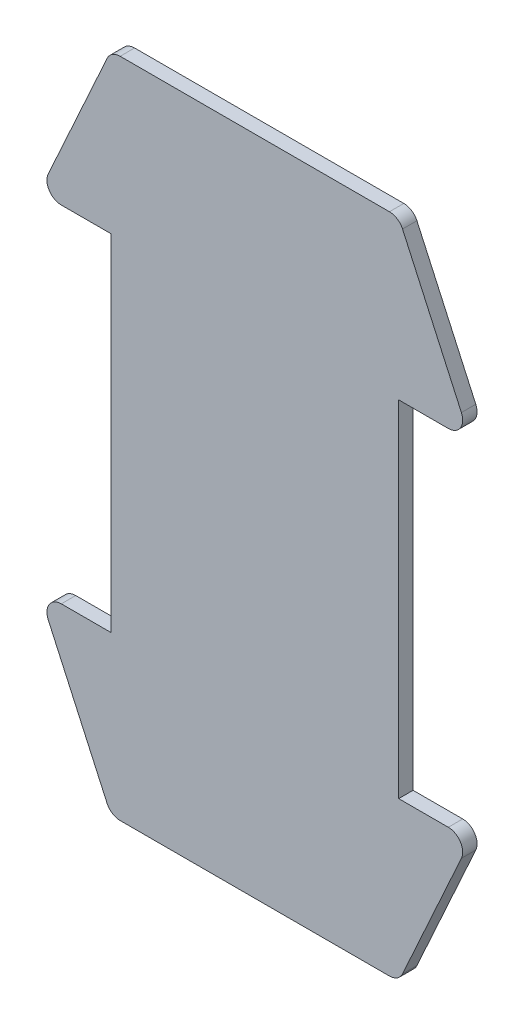
ISO-10303-21;
HEADER;
FILE_DESCRIPTION(('STEP AP214'),'2;1');
FILE_NAME('part.step','',(''),(''),'','','');
FILE_SCHEMA(('AUTOMOTIVE_DESIGN { 1 0 10303 214 1 1 1 1 }'));
ENDSEC;
DATA;
#1=APPLICATION_CONTEXT('core data for automotive mechanical design processes');
#2=APPLICATION_PROTOCOL_DEFINITION('international standard','automotive_design',2000,#1);
#3=PRODUCT_CONTEXT('',#1,'mechanical');
#4=PRODUCT('Part','Part','',(#3));
#5=PRODUCT_RELATED_PRODUCT_CATEGORY('part','',(#4));
#6=PRODUCT_DEFINITION_FORMATION('','',#4);
#7=PRODUCT_DEFINITION_CONTEXT('part definition',#1,'design');
#8=PRODUCT_DEFINITION('design','',#6,#7);
#9=PRODUCT_DEFINITION_SHAPE('','',#8);
#10=(LENGTH_UNIT() NAMED_UNIT(*) SI_UNIT(.MILLI.,.METRE.));
#11=(NAMED_UNIT(*) PLANE_ANGLE_UNIT() SI_UNIT($,.RADIAN.));
#12=(NAMED_UNIT(*) SI_UNIT($,.STERADIAN.) SOLID_ANGLE_UNIT());
#13=UNCERTAINTY_MEASURE_WITH_UNIT(LENGTH_MEASURE(1.E-05),#10,'distance_accuracy_value','');
#14=(GEOMETRIC_REPRESENTATION_CONTEXT(3) GLOBAL_UNCERTAINTY_ASSIGNED_CONTEXT((#13)) GLOBAL_UNIT_ASSIGNED_CONTEXT((#10,
#11,#12)) REPRESENTATION_CONTEXT('',''));
#15=CARTESIAN_POINT('',(0.,0.,0.));
#16=DIRECTION('',(0.,0.,1.));
#17=DIRECTION('',(1.,0.,0.));
#18=AXIS2_PLACEMENT_3D('',#15,#16,#17);
#19=CARTESIAN_POINT('',(-50.,115.,-5.));
#20=DIRECTION('',(-0.910366477462605,0.413802944301184,0.));
#21=DIRECTION('',(-0.413802944301184,-0.910366477462605,0.));
#22=AXIS2_PLACEMENT_3D('',#19,#20,#21);
#23=PLANE('',#22);
#24=DIRECTION('',(-0.413802944301183,-0.910366477462605,0.));
#25=VECTOR('',#24,1.);
#26=CARTESIAN_POINT('',(-50.,115.,-5.));
#27=LINE('',#26,#25);
#28=CARTESIAN_POINT('',(-51.3322660356791,112.069014721506,-5.));
#29=VERTEX_POINT('',#28);
#30=CARTESIAN_POINT('',(-71.7868114902246,67.0690147215059,-5.));
#31=VERTEX_POINT('',#30);
#32=EDGE_CURVE('E186',#29,#31,#27,.T.);
#33=ORIENTED_EDGE('',*,*,#32,.T.);
#34=DIRECTION('',(0.,0.,1.));
#35=VECTOR('',#34,1.);
#36=CARTESIAN_POINT('',(-71.7868114902246,67.0690147215059,-5.));
#37=LINE('',#36,#35);
#38=CARTESIAN_POINT('',(-71.7868114902246,67.0690147215059,0.));
#39=VERTEX_POINT('',#38);
#40=EDGE_CURVE('E378',#31,#39,#37,.T.);
#41=ORIENTED_EDGE('',*,*,#40,.T.);
#42=DIRECTION('',(-0.413802944301183,-0.910366477462605,0.));
#43=VECTOR('',#42,1.);
#44=CARTESIAN_POINT('',(-50.,115.,0.));
#45=LINE('',#44,#43);
#46=CARTESIAN_POINT('',(-51.3322660356791,112.069014721506,0.));
#47=VERTEX_POINT('',#46);
#48=EDGE_CURVE('E236',#47,#39,#45,.T.);
#49=ORIENTED_EDGE('',*,*,#48,.F.);
#50=DIRECTION('',(0.,0.,1.));
#51=VECTOR('',#50,1.);
#52=CARTESIAN_POINT('',(-51.3322660356791,112.069014721506,-5.));
#53=LINE('',#52,#51);
#54=EDGE_CURVE('E375',#47,#29,#53,.F.);
#55=ORIENTED_EDGE('',*,*,#54,.T.);
#56=EDGE_LOOP('',(#33,#41,#49,#55));
#57=FACE_BOUND('',#56,.T.);
#58=ADVANCED_FACE('F39',(#57),#23,.T.);
#59=CARTESIAN_POINT('',(50.,115.,-5.));
#60=DIRECTION('',(0.,1.,0.));
#61=DIRECTION('',(0.,0.,1.));
#62=AXIS2_PLACEMENT_3D('',#59,#60,#61);
#63=PLANE('',#62);
#64=DIRECTION('',(-1.,0.,0.));
#65=VECTOR('',#64,1.);
#66=CARTESIAN_POINT('',(50.,115.,0.));
#67=LINE('',#66,#65);
#68=CARTESIAN_POINT('',(46.7804336483661,115.,0.));
#69=VERTEX_POINT('',#68);
#70=CARTESIAN_POINT('',(-46.7804336483661,115.,0.));
#71=VERTEX_POINT('',#70);
#72=EDGE_CURVE('E276',#69,#71,#67,.T.);
#73=ORIENTED_EDGE('',*,*,#72,.F.);
#74=DIRECTION('',(0.,0.,1.));
#75=VECTOR('',#74,1.);
#76=CARTESIAN_POINT('',(46.7804336483661,115.,-5.));
#77=LINE('',#76,#75);
#78=CARTESIAN_POINT('',(46.7804336483661,115.,-5.));
#79=VERTEX_POINT('',#78);
#80=EDGE_CURVE('E11',#69,#79,#77,.F.);
#81=ORIENTED_EDGE('',*,*,#80,.T.);
#82=DIRECTION('',(-1.,0.,0.));
#83=VECTOR('',#82,1.);
#84=CARTESIAN_POINT('',(50.,115.,-5.));
#85=LINE('',#84,#83);
#86=CARTESIAN_POINT('',(-46.7804336483661,115.,-5.));
#87=VERTEX_POINT('',#86);
#88=EDGE_CURVE('E195',#79,#87,#85,.T.);
#89=ORIENTED_EDGE('',*,*,#88,.T.);
#90=DIRECTION('',(0.,0.,1.));
#91=VECTOR('',#90,1.);
#92=CARTESIAN_POINT('',(-46.7804336483661,115.,-5.));
#93=LINE('',#92,#91);
#94=EDGE_CURVE('E48',#87,#71,#93,.T.);
#95=ORIENTED_EDGE('',*,*,#94,.T.);
#96=EDGE_LOOP('',(#73,#81,#89,#95));
#97=FACE_BOUND('',#96,.T.);
#98=ADVANCED_FACE('F388',(#97),#63,.T.);
#99=CARTESIAN_POINT('',(50.,115.,-5.));
#100=DIRECTION('',(0.910366477462605,0.413802944301184,0.));
#101=DIRECTION('',(-0.413802944301184,0.910366477462605,0.));
#102=AXIS2_PLACEMENT_3D('',#99,#100,#101);
#103=PLANE('',#102);
#104=DIRECTION('',(-0.413802944301183,0.910366477462605,0.));
#105=VECTOR('',#104,1.);
#106=CARTESIAN_POINT('',(50.,115.,0.));
#107=LINE('',#106,#105);
#108=CARTESIAN_POINT('',(71.7868114902246,67.0690147215059,0.));
#109=VERTEX_POINT('',#108);
#110=CARTESIAN_POINT('',(51.3322660356791,112.069014721506,0.));
#111=VERTEX_POINT('',#110);
#112=EDGE_CURVE('E272',#109,#111,#107,.T.);
#113=ORIENTED_EDGE('',*,*,#112,.F.);
#114=DIRECTION('',(0.,0.,1.));
#115=VECTOR('',#114,1.);
#116=CARTESIAN_POINT('',(71.7868114902246,67.0690147215059,-5.));
#117=LINE('',#116,#115);
#118=CARTESIAN_POINT('',(71.7868114902246,67.0690147215059,-5.));
#119=VERTEX_POINT('',#118);
#120=EDGE_CURVE('E372',#109,#119,#117,.F.);
#121=ORIENTED_EDGE('',*,*,#120,.T.);
#122=DIRECTION('',(-0.413802944301183,0.910366477462605,0.));
#123=VECTOR('',#122,1.);
#124=CARTESIAN_POINT('',(50.,115.,-5.));
#125=LINE('',#124,#123);
#126=CARTESIAN_POINT('',(51.3322660356791,112.069014721506,-5.));
#127=VERTEX_POINT('',#126);
#128=EDGE_CURVE('E229',#119,#127,#125,.T.);
#129=ORIENTED_EDGE('',*,*,#128,.T.);
#130=DIRECTION('',(0.,0.,1.));
#131=VECTOR('',#130,1.);
#132=CARTESIAN_POINT('',(51.3322660356791,112.069014721506,-5.));
#133=LINE('',#132,#131);
#134=EDGE_CURVE('E368',#127,#111,#133,.T.);
#135=ORIENTED_EDGE('',*,*,#134,.T.);
#136=EDGE_LOOP('',(#113,#121,#129,#135));
#137=FACE_BOUND('',#136,.T.);
#138=ADVANCED_FACE('F402',(#137),#103,.T.);
#139=CARTESIAN_POINT('',(75.,60.,-5.));
#140=DIRECTION('',(0.,-1.,0.));
#141=DIRECTION('',(0.,0.,-1.));
#142=AXIS2_PLACEMENT_3D('',#139,#140,#141);
#143=PLANE('',#142);
#144=DIRECTION('',(1.,0.,0.));
#145=VECTOR('',#144,1.);
#146=CARTESIAN_POINT('',(75.,60.,-5.));
#147=LINE('',#146,#145);
#148=CARTESIAN_POINT('',(50.,60.,-5.));
#149=VERTEX_POINT('',#148);
#150=CARTESIAN_POINT('',(67.2349791029115,60.,-5.));
#151=VERTEX_POINT('',#150);
#152=EDGE_CURVE('E225',#149,#151,#147,.T.);
#153=ORIENTED_EDGE('',*,*,#152,.T.);
#154=DIRECTION('',(0.,0.,1.));
#155=VECTOR('',#154,1.);
#156=CARTESIAN_POINT('',(67.2349791029115,60.,-5.));
#157=LINE('',#156,#155);
#158=CARTESIAN_POINT('',(67.2349791029115,60.,0.));
#159=VERTEX_POINT('',#158);
#160=EDGE_CURVE('E364',#151,#159,#157,.T.);
#161=ORIENTED_EDGE('',*,*,#160,.T.);
#162=DIRECTION('',(1.,0.,0.));
#163=VECTOR('',#162,1.);
#164=CARTESIAN_POINT('',(75.,60.,0.));
#165=LINE('',#164,#163);
#166=CARTESIAN_POINT('',(50.,60.,0.));
#167=VERTEX_POINT('',#166);
#168=EDGE_CURVE('E268',#167,#159,#165,.T.);
#169=ORIENTED_EDGE('',*,*,#168,.F.);
#170=DIRECTION('',(0.,0.,1.));
#171=VECTOR('',#170,1.);
#172=CARTESIAN_POINT('',(50.,60.,-5.));
#173=LINE('',#172,#171);
#174=EDGE_CURVE('E280',#149,#167,#173,.T.);
#175=ORIENTED_EDGE('',*,*,#174,.F.);
#176=EDGE_LOOP('',(#153,#161,#169,#175));
#177=FACE_BOUND('',#176,.T.);
#178=ADVANCED_FACE('F412',(#177),#143,.T.);
#179=CARTESIAN_POINT('',(50.,60.,-5.));
#180=DIRECTION('',(1.,0.,0.));
#181=DIRECTION('',(0.,1.,0.));
#182=AXIS2_PLACEMENT_3D('',#179,#180,#181);
#183=PLANE('',#182);
#184=DIRECTION('',(0.,1.,0.));
#185=VECTOR('',#184,1.);
#186=CARTESIAN_POINT('',(50.,60.,0.));
#187=LINE('',#186,#185);
#188=CARTESIAN_POINT('',(50.,-59.9999999999999,0.));
#189=VERTEX_POINT('',#188);
#190=EDGE_CURVE('E264',#189,#167,#187,.T.);
#191=ORIENTED_EDGE('',*,*,#190,.F.);
#192=DIRECTION('',(0.,0.,1.));
#193=VECTOR('',#192,1.);
#194=CARTESIAN_POINT('',(50.,-59.9999999999999,-5.));
#195=LINE('',#194,#193);
#196=CARTESIAN_POINT('',(50.,-59.9999999999999,-5.));
#197=VERTEX_POINT('',#196);
#198=EDGE_CURVE('E284',#197,#189,#195,.T.);
#199=ORIENTED_EDGE('',*,*,#198,.F.);
#200=DIRECTION('',(0.,1.,0.));
#201=VECTOR('',#200,1.);
#202=CARTESIAN_POINT('',(50.,60.,-5.));
#203=LINE('',#202,#201);
#204=EDGE_CURVE('E221',#197,#149,#203,.T.);
#205=ORIENTED_EDGE('',*,*,#204,.T.);
#206=ORIENTED_EDGE('',*,*,#174,.T.);
#207=EDGE_LOOP('',(#191,#199,#205,#206));
#208=FACE_BOUND('',#207,.T.);
#209=ADVANCED_FACE('F417',(#208),#183,.T.);
#210=CARTESIAN_POINT('',(75.,-59.9999999999999,-5.));
#211=DIRECTION('',(0.,1.,0.));
#212=DIRECTION('',(-1.,0.,0.));
#213=AXIS2_PLACEMENT_3D('',#210,#211,#212);
#214=PLANE('',#213);
#215=DIRECTION('',(-1.,0.,0.));
#216=VECTOR('',#215,1.);
#217=CARTESIAN_POINT('',(75.,-59.9999999999999,0.));
#218=LINE('',#217,#216);
#219=CARTESIAN_POINT('',(67.2349791029116,-59.9999999999999,0.));
#220=VERTEX_POINT('',#219);
#221=EDGE_CURVE('E261',#220,#189,#218,.T.);
#222=ORIENTED_EDGE('',*,*,#221,.F.);
#223=DIRECTION('',(0.,0.,1.));
#224=VECTOR('',#223,1.);
#225=CARTESIAN_POINT('',(67.2349791029116,-59.9999999999999,-5.));
#226=LINE('',#225,#224);
#227=CARTESIAN_POINT('',(67.2349791029116,-59.9999999999999,-5.));
#228=VERTEX_POINT('',#227);
#229=EDGE_CURVE('E361',#220,#228,#226,.F.);
#230=ORIENTED_EDGE('',*,*,#229,.T.);
#231=DIRECTION('',(-1.,0.,0.));
#232=VECTOR('',#231,1.);
#233=CARTESIAN_POINT('',(75.,-59.9999999999999,-5.));
#234=LINE('',#233,#232);
#235=EDGE_CURVE('E218',#228,#197,#234,.T.);
#236=ORIENTED_EDGE('',*,*,#235,.T.);
#237=ORIENTED_EDGE('',*,*,#198,.T.);
#238=EDGE_LOOP('',(#222,#230,#236,#237));
#239=FACE_BOUND('',#238,.T.);
#240=ADVANCED_FACE('F581',(#239),#214,.T.);
#241=CARTESIAN_POINT('',(50.0000000000001,-115.,-5.));
#242=DIRECTION('',(0.910366477462605,-0.413802944301183,0.));
#243=DIRECTION('',(0.413802944301183,0.910366477462605,0.));
#244=AXIS2_PLACEMENT_3D('',#241,#242,#243);
#245=PLANE('',#244);
#246=DIRECTION('',(0.413802944301183,0.910366477462605,0.));
#247=VECTOR('',#246,1.);
#248=CARTESIAN_POINT('',(50.0000000000001,-115.,0.));
#249=LINE('',#248,#247);
#250=CARTESIAN_POINT('',(51.3322660356792,-112.069014721506,0.));
#251=VERTEX_POINT('',#250);
#252=CARTESIAN_POINT('',(71.7868114902246,-67.0690147215059,0.));
#253=VERTEX_POINT('',#252);
#254=EDGE_CURVE('E257',#251,#253,#249,.T.);
#255=ORIENTED_EDGE('',*,*,#254,.F.);
#256=DIRECTION('',(0.,0.,1.));
#257=VECTOR('',#256,1.);
#258=CARTESIAN_POINT('',(51.3322660356792,-112.069014721506,-5.));
#259=LINE('',#258,#257);
#260=CARTESIAN_POINT('',(51.3322660356792,-112.069014721506,-5.));
#261=VERTEX_POINT('',#260);
#262=EDGE_CURVE('E358',#251,#261,#259,.F.);
#263=ORIENTED_EDGE('',*,*,#262,.T.);
#264=DIRECTION('',(0.413802944301183,0.910366477462605,0.));
#265=VECTOR('',#264,1.);
#266=CARTESIAN_POINT('',(50.0000000000001,-115.,-5.));
#267=LINE('',#266,#265);
#268=CARTESIAN_POINT('',(71.7868114902246,-67.0690147215059,-5.));
#269=VERTEX_POINT('',#268);
#270=EDGE_CURVE('E214',#261,#269,#267,.T.);
#271=ORIENTED_EDGE('',*,*,#270,.T.);
#272=DIRECTION('',(0.,0.,1.));
#273=VECTOR('',#272,1.);
#274=CARTESIAN_POINT('',(71.7868114902246,-67.0690147215058,-5.));
#275=LINE('',#274,#273);
#276=EDGE_CURVE('E354',#269,#253,#275,.T.);
#277=ORIENTED_EDGE('',*,*,#276,.T.);
#278=EDGE_LOOP('',(#255,#263,#271,#277));
#279=FACE_BOUND('',#278,.T.);
#280=ADVANCED_FACE('F429',(#279),#245,.T.);
#281=CARTESIAN_POINT('',(50.0000000000001,-115.,-5.));
#282=DIRECTION('',(0.,-1.,0.));
#283=DIRECTION('',(0.,0.,-1.));
#284=AXIS2_PLACEMENT_3D('',#281,#282,#283);
#285=PLANE('',#284);
#286=DIRECTION('',(1.,0.,0.));
#287=VECTOR('',#286,1.);
#288=CARTESIAN_POINT('',(50.0000000000001,-115.,0.));
#289=LINE('',#288,#287);
#290=CARTESIAN_POINT('',(-46.7804336483662,-115.,0.));
#291=VERTEX_POINT('',#290);
#292=CARTESIAN_POINT('',(46.7804336483662,-115.,0.));
#293=VERTEX_POINT('',#292);
#294=EDGE_CURVE('E253',#291,#293,#289,.T.);
#295=ORIENTED_EDGE('',*,*,#294,.F.);
#296=DIRECTION('',(0.,0.,1.));
#297=VECTOR('',#296,1.);
#298=CARTESIAN_POINT('',(-46.7804336483662,-115.,-5.));
#299=LINE('',#298,#297);
#300=CARTESIAN_POINT('',(-46.7804336483662,-115.,-5.));
#301=VERTEX_POINT('',#300);
#302=EDGE_CURVE('E324',#291,#301,#299,.F.);
#303=ORIENTED_EDGE('',*,*,#302,.T.);
#304=DIRECTION('',(1.,0.,0.));
#305=VECTOR('',#304,1.);
#306=CARTESIAN_POINT('',(50.0000000000001,-115.,-5.));
#307=LINE('',#306,#305);
#308=CARTESIAN_POINT('',(46.7804336483662,-115.,-5.));
#309=VERTEX_POINT('',#308);
#310=EDGE_CURVE('E210',#301,#309,#307,.T.);
#311=ORIENTED_EDGE('',*,*,#310,.T.);
#312=DIRECTION('',(0.,0.,1.));
#313=VECTOR('',#312,1.);
#314=CARTESIAN_POINT('',(46.7804336483662,-115.,-5.));
#315=LINE('',#314,#313);
#316=EDGE_CURVE('E320',#309,#293,#315,.T.);
#317=ORIENTED_EDGE('',*,*,#316,.T.);
#318=EDGE_LOOP('',(#295,#303,#311,#317));
#319=FACE_BOUND('',#318,.T.);
#320=ADVANCED_FACE('F437',(#319),#285,.T.);
#321=CARTESIAN_POINT('',(-50.0000000000001,-115.,-5.));
#322=DIRECTION('',(-0.910366477462605,-0.413802944301183,0.));
#323=DIRECTION('',(0.413802944301183,-0.910366477462605,0.));
#324=AXIS2_PLACEMENT_3D('',#321,#322,#323);
#325=PLANE('',#324);
#326=DIRECTION('',(0.413802944301183,-0.910366477462605,0.));
#327=VECTOR('',#326,1.);
#328=CARTESIAN_POINT('',(-50.0000000000001,-115.,-5.));
#329=LINE('',#328,#327);
#330=CARTESIAN_POINT('',(-71.7868114902246,-67.0690147215059,-5.));
#331=VERTEX_POINT('',#330);
#332=CARTESIAN_POINT('',(-51.3322660356792,-112.069014721506,-5.));
#333=VERTEX_POINT('',#332);
#334=EDGE_CURVE('E203',#331,#333,#329,.T.);
#335=ORIENTED_EDGE('',*,*,#334,.T.);
#336=DIRECTION('',(0.,0.,1.));
#337=VECTOR('',#336,1.);
#338=CARTESIAN_POINT('',(-51.3322660356792,-112.069014721506,-5.));
#339=LINE('',#338,#337);
#340=CARTESIAN_POINT('',(-51.3322660356792,-112.069014721506,0.));
#341=VERTEX_POINT('',#340);
#342=EDGE_CURVE('E292',#333,#341,#339,.T.);
#343=ORIENTED_EDGE('',*,*,#342,.T.);
#344=DIRECTION('',(0.413802944301183,-0.910366477462605,0.));
#345=VECTOR('',#344,1.);
#346=CARTESIAN_POINT('',(-50.0000000000001,-115.,0.));
#347=LINE('',#346,#345);
#348=CARTESIAN_POINT('',(-71.7868114902246,-67.0690147215059,0.));
#349=VERTEX_POINT('',#348);
#350=EDGE_CURVE('E249',#349,#341,#347,.T.);
#351=ORIENTED_EDGE('',*,*,#350,.F.);
#352=DIRECTION('',(0.,0.,1.));
#353=VECTOR('',#352,1.);
#354=CARTESIAN_POINT('',(-71.7868114902246,-67.0690147215058,-5.));
#355=LINE('',#354,#353);
#356=EDGE_CURVE('E283',#349,#331,#355,.F.);
#357=ORIENTED_EDGE('',*,*,#356,.T.);
#358=EDGE_LOOP('',(#335,#343,#351,#357));
#359=FACE_BOUND('',#358,.T.);
#360=ADVANCED_FACE('F445',(#359),#325,.T.);
#361=CARTESIAN_POINT('',(-75.,-59.9999999999999,-5.));
#362=DIRECTION('',(0.,1.,0.));
#363=DIRECTION('',(-1.,0.,0.));
#364=AXIS2_PLACEMENT_3D('',#361,#362,#363);
#365=PLANE('',#364);
#366=DIRECTION('',(-1.,0.,0.));
#367=VECTOR('',#366,1.);
#368=CARTESIAN_POINT('',(-75.,-59.9999999999999,-5.));
#369=LINE('',#368,#367);
#370=CARTESIAN_POINT('',(-50.,-59.9999999999999,-5.));
#371=VERTEX_POINT('',#370);
#372=CARTESIAN_POINT('',(-67.2349791029116,-59.9999999999999,-5.));
#373=VERTEX_POINT('',#372);
#374=EDGE_CURVE('E199',#371,#373,#369,.T.);
#375=ORIENTED_EDGE('',*,*,#374,.T.);
#376=DIRECTION('',(0.,0.,1.));
#377=VECTOR('',#376,1.);
#378=CARTESIAN_POINT('',(-67.2349791029116,-59.9999999999999,-5.));
#379=LINE('',#378,#377);
#380=CARTESIAN_POINT('',(-67.2349791029116,-59.9999999999999,0.));
#381=VERTEX_POINT('',#380);
#382=EDGE_CURVE('E350',#373,#381,#379,.T.);
#383=ORIENTED_EDGE('',*,*,#382,.T.);
#384=DIRECTION('',(-1.,0.,0.));
#385=VECTOR('',#384,1.);
#386=CARTESIAN_POINT('',(-75.,-59.9999999999999,0.));
#387=LINE('',#386,#385);
#388=CARTESIAN_POINT('',(-50.,-59.9999999999999,0.));
#389=VERTEX_POINT('',#388);
#390=EDGE_CURVE('E245',#389,#381,#387,.T.);
#391=ORIENTED_EDGE('',*,*,#390,.F.);
#392=DIRECTION('',(0.,0.,1.));
#393=VECTOR('',#392,1.);
#394=CARTESIAN_POINT('',(-50.,-59.9999999999999,-5.));
#395=LINE('',#394,#393);
#396=EDGE_CURVE('E194',#371,#389,#395,.T.);
#397=ORIENTED_EDGE('',*,*,#396,.F.);
#398=EDGE_LOOP('',(#375,#383,#391,#397));
#399=FACE_BOUND('',#398,.T.);
#400=ADVANCED_FACE('F452',(#399),#365,.T.);
#401=CARTESIAN_POINT('',(-50.,60.,-5.));
#402=DIRECTION('',(-1.,0.,0.));
#403=DIRECTION('',(0.,-1.,0.));
#404=AXIS2_PLACEMENT_3D('',#401,#402,#403);
#405=PLANE('',#404);
#406=DIRECTION('',(0.,-1.,0.));
#407=VECTOR('',#406,1.);
#408=CARTESIAN_POINT('',(-50.,60.,0.));
#409=LINE('',#408,#407);
#410=CARTESIAN_POINT('',(-50.,60.,0.));
#411=VERTEX_POINT('',#410);
#412=EDGE_CURVE('E192',#411,#389,#409,.T.);
#413=ORIENTED_EDGE('',*,*,#412,.F.);
#414=DIRECTION('',(0.,0.,1.));
#415=VECTOR('',#414,1.);
#416=CARTESIAN_POINT('',(-50.,60.,-5.));
#417=LINE('',#416,#415);
#418=CARTESIAN_POINT('',(-50.,60.,-5.));
#419=VERTEX_POINT('',#418);
#420=EDGE_CURVE('E180',#419,#411,#417,.T.);
#421=ORIENTED_EDGE('',*,*,#420,.F.);
#422=DIRECTION('',(0.,-1.,0.));
#423=VECTOR('',#422,1.);
#424=CARTESIAN_POINT('',(-50.,60.,-5.));
#425=LINE('',#424,#423);
#426=EDGE_CURVE('E185',#419,#371,#425,.T.);
#427=ORIENTED_EDGE('',*,*,#426,.T.);
#428=ORIENTED_EDGE('',*,*,#396,.T.);
#429=EDGE_LOOP('',(#413,#421,#427,#428));
#430=FACE_BOUND('',#429,.T.);
#431=ADVANCED_FACE('F190',(#430),#405,.T.);
#432=CARTESIAN_POINT('',(-75.,60.,-5.));
#433=DIRECTION('',(0.,-1.,0.));
#434=DIRECTION('',(0.,0.,-1.));
#435=AXIS2_PLACEMENT_3D('',#432,#433,#434);
#436=PLANE('',#435);
#437=DIRECTION('',(1.,0.,0.));
#438=VECTOR('',#437,1.);
#439=CARTESIAN_POINT('',(-75.,60.,0.));
#440=LINE('',#439,#438);
#441=CARTESIAN_POINT('',(-67.2349791029115,60.,0.));
#442=VERTEX_POINT('',#441);
#443=EDGE_CURVE('E240',#442,#411,#440,.T.);
#444=ORIENTED_EDGE('',*,*,#443,.F.);
#445=DIRECTION('',(0.,0.,1.));
#446=VECTOR('',#445,1.);
#447=CARTESIAN_POINT('',(-67.2349791029115,60.,-5.));
#448=LINE('',#447,#446);
#449=CARTESIAN_POINT('',(-67.2349791029115,60.,-5.));
#450=VERTEX_POINT('',#449);
#451=EDGE_CURVE('E55',#442,#450,#448,.F.);
#452=ORIENTED_EDGE('',*,*,#451,.T.);
#453=DIRECTION('',(1.,0.,0.));
#454=VECTOR('',#453,1.);
#455=CARTESIAN_POINT('',(-75.,60.,-5.));
#456=LINE('',#455,#454);
#457=EDGE_CURVE('E177',#450,#419,#456,.T.);
#458=ORIENTED_EDGE('',*,*,#457,.T.);
#459=ORIENTED_EDGE('',*,*,#420,.T.);
#460=EDGE_LOOP('',(#444,#452,#458,#459));
#461=FACE_BOUND('',#460,.T.);
#462=ADVANCED_FACE('F179',(#461),#436,.T.);
#463=CARTESIAN_POINT('',(0.,0.,-5.));
#464=DIRECTION('',(0.,0.,1.));
#465=DIRECTION('',(1.,0.,0.));
#466=AXIS2_PLACEMENT_3D('',#463,#464,#465);
#467=PLANE('',#466);
#468=ORIENTED_EDGE('',*,*,#310,.F.);
#469=CARTESIAN_POINT('',(-46.7804336483662,-110.,-5.));
#470=DIRECTION('',(0.,0.,1.));
#471=DIRECTION('',(1.,0.,0.));
#472=AXIS2_PLACEMENT_3D('',#469,#470,#471);
#473=CIRCLE('',#472,5.);
#474=EDGE_CURVE('E347',#301,#333,#473,.F.);
#475=ORIENTED_EDGE('',*,*,#474,.T.);
#476=ORIENTED_EDGE('',*,*,#334,.F.);
#477=CARTESIAN_POINT('',(-67.2349791029116,-64.9999999999999,-5.));
#478=DIRECTION('',(0.,0.,1.));
#479=DIRECTION('',(1.,0.,0.));
#480=AXIS2_PLACEMENT_3D('',#477,#478,#479);
#481=CIRCLE('',#480,5.);
#482=EDGE_CURVE('E63',#331,#373,#481,.F.);
#483=ORIENTED_EDGE('',*,*,#482,.T.);
#484=ORIENTED_EDGE('',*,*,#374,.F.);
#485=ORIENTED_EDGE('',*,*,#426,.F.);
#486=ORIENTED_EDGE('',*,*,#457,.F.);
#487=CARTESIAN_POINT('',(-67.2349791029115,65.,-5.));
#488=DIRECTION('',(0.,0.,1.));
#489=DIRECTION('',(1.,0.,0.));
#490=AXIS2_PLACEMENT_3D('',#487,#488,#489);
#491=CIRCLE('',#490,5.);
#492=EDGE_CURVE('E333',#450,#31,#491,.F.);
#493=ORIENTED_EDGE('',*,*,#492,.T.);
#494=ORIENTED_EDGE('',*,*,#32,.F.);
#495=CARTESIAN_POINT('',(-46.7804336483661,110.,-5.));
#496=DIRECTION('',(0.,0.,1.));
#497=DIRECTION('',(1.,0.,0.));
#498=AXIS2_PLACEMENT_3D('',#495,#496,#497);
#499=CIRCLE('',#498,5.);
#500=EDGE_CURVE('E327',#29,#87,#499,.F.);
#501=ORIENTED_EDGE('',*,*,#500,.T.);
#502=ORIENTED_EDGE('',*,*,#88,.F.);
#503=CARTESIAN_POINT('',(46.7804336483661,110.,-5.));
#504=DIRECTION('',(0.,0.,1.));
#505=DIRECTION('',(1.,0.,0.));
#506=AXIS2_PLACEMENT_3D('',#503,#504,#505);
#507=CIRCLE('',#506,5.);
#508=EDGE_CURVE('E330',#79,#127,#507,.F.);
#509=ORIENTED_EDGE('',*,*,#508,.T.);
#510=ORIENTED_EDGE('',*,*,#128,.F.);
#511=CARTESIAN_POINT('',(67.2349791029115,65.,-5.));
#512=DIRECTION('',(0.,0.,1.));
#513=DIRECTION('',(1.,0.,0.));
#514=AXIS2_PLACEMENT_3D('',#511,#512,#513);
#515=CIRCLE('',#514,5.);
#516=EDGE_CURVE('E336',#119,#151,#515,.F.);
#517=ORIENTED_EDGE('',*,*,#516,.T.);
#518=ORIENTED_EDGE('',*,*,#152,.F.);
#519=ORIENTED_EDGE('',*,*,#204,.F.);
#520=ORIENTED_EDGE('',*,*,#235,.F.);
#521=CARTESIAN_POINT('',(67.2349791029116,-64.9999999999999,-5.));
#522=DIRECTION('',(0.,0.,1.));
#523=DIRECTION('',(1.,0.,0.));
#524=AXIS2_PLACEMENT_3D('',#521,#522,#523);
#525=CIRCLE('',#524,5.);
#526=EDGE_CURVE('E339',#228,#269,#525,.F.);
#527=ORIENTED_EDGE('',*,*,#526,.T.);
#528=ORIENTED_EDGE('',*,*,#270,.F.);
#529=CARTESIAN_POINT('',(46.7804336483662,-110.,-5.));
#530=DIRECTION('',(0.,0.,1.));
#531=DIRECTION('',(1.,0.,0.));
#532=AXIS2_PLACEMENT_3D('',#529,#530,#531);
#533=CIRCLE('',#532,5.);
#534=EDGE_CURVE('E342',#261,#309,#533,.F.);
#535=ORIENTED_EDGE('',*,*,#534,.T.);
#536=EDGE_LOOP('',(#468,#475,#476,#483,#484,#485,#486,#493,#494,#501,#502,#509,#510,#517,#518,
#519,#520,#527,#528,#535));
#537=FACE_BOUND('',#536,.T.);
#538=ADVANCED_FACE('F198',(#537),#467,.F.);
#539=CARTESIAN_POINT('',(0.,0.,0.));
#540=DIRECTION('',(0.,0.,1.));
#541=DIRECTION('',(1.,0.,0.));
#542=AXIS2_PLACEMENT_3D('',#539,#540,#541);
#543=PLANE('',#542);
#544=ORIENTED_EDGE('',*,*,#350,.T.);
#545=CARTESIAN_POINT('',(-46.7804336483662,-110.,0.));
#546=DIRECTION('',(0.,0.,1.));
#547=DIRECTION('',(1.,0.,0.));
#548=AXIS2_PLACEMENT_3D('',#545,#546,#547);
#549=CIRCLE('',#548,5.);
#550=EDGE_CURVE('E317',#341,#291,#549,.T.);
#551=ORIENTED_EDGE('',*,*,#550,.T.);
#552=ORIENTED_EDGE('',*,*,#294,.T.);
#553=CARTESIAN_POINT('',(46.7804336483662,-110.,0.));
#554=DIRECTION('',(0.,0.,1.));
#555=DIRECTION('',(1.,0.,0.));
#556=AXIS2_PLACEMENT_3D('',#553,#554,#555);
#557=CIRCLE('',#556,5.);
#558=EDGE_CURVE('E311',#293,#251,#557,.T.);
#559=ORIENTED_EDGE('',*,*,#558,.T.);
#560=ORIENTED_EDGE('',*,*,#254,.T.);
#561=CARTESIAN_POINT('',(67.2349791029116,-64.9999999999999,0.));
#562=DIRECTION('',(0.,0.,1.));
#563=DIRECTION('',(1.,0.,0.));
#564=AXIS2_PLACEMENT_3D('',#561,#562,#563);
#565=CIRCLE('',#564,5.);
#566=EDGE_CURVE('E308',#253,#220,#565,.T.);
#567=ORIENTED_EDGE('',*,*,#566,.T.);
#568=ORIENTED_EDGE('',*,*,#221,.T.);
#569=ORIENTED_EDGE('',*,*,#190,.T.);
#570=ORIENTED_EDGE('',*,*,#168,.T.);
#571=CARTESIAN_POINT('',(67.2349791029115,65.,0.));
#572=DIRECTION('',(0.,0.,1.));
#573=DIRECTION('',(1.,0.,0.));
#574=AXIS2_PLACEMENT_3D('',#571,#572,#573);
#575=CIRCLE('',#574,5.);
#576=EDGE_CURVE('E305',#159,#109,#575,.T.);
#577=ORIENTED_EDGE('',*,*,#576,.T.);
#578=ORIENTED_EDGE('',*,*,#112,.T.);
#579=CARTESIAN_POINT('',(46.7804336483661,110.,0.));
#580=DIRECTION('',(0.,0.,1.));
#581=DIRECTION('',(1.,0.,0.));
#582=AXIS2_PLACEMENT_3D('',#579,#580,#581);
#583=CIRCLE('',#582,5.);
#584=EDGE_CURVE('E299',#111,#69,#583,.T.);
#585=ORIENTED_EDGE('',*,*,#584,.T.);
#586=ORIENTED_EDGE('',*,*,#72,.T.);
#587=CARTESIAN_POINT('',(-46.7804336483661,110.,0.));
#588=DIRECTION('',(0.,0.,1.));
#589=DIRECTION('',(1.,0.,0.));
#590=AXIS2_PLACEMENT_3D('',#587,#588,#589);
#591=CIRCLE('',#590,5.);
#592=EDGE_CURVE('E296',#71,#47,#591,.T.);
#593=ORIENTED_EDGE('',*,*,#592,.T.);
#594=ORIENTED_EDGE('',*,*,#48,.T.);
#595=CARTESIAN_POINT('',(-67.2349791029115,65.,0.));
#596=DIRECTION('',(0.,0.,1.));
#597=DIRECTION('',(1.,0.,0.));
#598=AXIS2_PLACEMENT_3D('',#595,#596,#597);
#599=CIRCLE('',#598,5.);
#600=EDGE_CURVE('E302',#39,#442,#599,.T.);
#601=ORIENTED_EDGE('',*,*,#600,.T.);
#602=ORIENTED_EDGE('',*,*,#443,.T.);
#603=ORIENTED_EDGE('',*,*,#412,.T.);
#604=ORIENTED_EDGE('',*,*,#390,.T.);
#605=CARTESIAN_POINT('',(-67.2349791029116,-64.9999999999999,0.));
#606=DIRECTION('',(0.,0.,1.));
#607=DIRECTION('',(1.,0.,0.));
#608=AXIS2_PLACEMENT_3D('',#605,#606,#607);
#609=CIRCLE('',#608,5.);
#610=EDGE_CURVE('E314',#381,#349,#609,.T.);
#611=ORIENTED_EDGE('',*,*,#610,.T.);
#612=EDGE_LOOP('',(#544,#551,#552,#559,#560,#567,#568,#569,#570,#577,#578,#585,#586,#593,#594,
#601,#602,#603,#604,#611));
#613=FACE_BOUND('',#612,.T.);
#614=ADVANCED_FACE('F394',(#613),#543,.T.);
#615=CARTESIAN_POINT('',(-46.7804336483662,-110.,-5.));
#616=DIRECTION('',(0.,0.,1.));
#617=DIRECTION('',(1.,0.,0.));
#618=AXIS2_PLACEMENT_3D('',#615,#616,#617);
#619=CYLINDRICAL_SURFACE('',#618,5.);
#620=ORIENTED_EDGE('',*,*,#474,.F.);
#621=ORIENTED_EDGE('',*,*,#302,.F.);
#622=ORIENTED_EDGE('',*,*,#550,.F.);
#623=ORIENTED_EDGE('',*,*,#342,.F.);
#624=EDGE_LOOP('',(#620,#621,#622,#623));
#625=FACE_BOUND('',#624,.T.);
#626=ADVANCED_FACE('F442',(#625),#619,.T.);
#627=CARTESIAN_POINT('',(-67.2349791029116,-64.9999999999999,-5.));
#628=DIRECTION('',(0.,0.,1.));
#629=DIRECTION('',(1.,0.,0.));
#630=AXIS2_PLACEMENT_3D('',#627,#628,#629);
#631=CYLINDRICAL_SURFACE('',#630,5.);
#632=ORIENTED_EDGE('',*,*,#482,.F.);
#633=ORIENTED_EDGE('',*,*,#356,.F.);
#634=ORIENTED_EDGE('',*,*,#610,.F.);
#635=ORIENTED_EDGE('',*,*,#382,.F.);
#636=EDGE_LOOP('',(#632,#633,#634,#635));
#637=FACE_BOUND('',#636,.T.);
#638=ADVANCED_FACE('F450',(#637),#631,.T.);
#639=CARTESIAN_POINT('',(46.7804336483662,-110.,-5.));
#640=DIRECTION('',(0.,0.,1.));
#641=DIRECTION('',(1.,0.,0.));
#642=AXIS2_PLACEMENT_3D('',#639,#640,#641);
#643=CYLINDRICAL_SURFACE('',#642,5.);
#644=ORIENTED_EDGE('',*,*,#534,.F.);
#645=ORIENTED_EDGE('',*,*,#262,.F.);
#646=ORIENTED_EDGE('',*,*,#558,.F.);
#647=ORIENTED_EDGE('',*,*,#316,.F.);
#648=EDGE_LOOP('',(#644,#645,#646,#647));
#649=FACE_BOUND('',#648,.T.);
#650=ADVANCED_FACE('F435',(#649),#643,.T.);
#651=CARTESIAN_POINT('',(67.2349791029116,-64.9999999999999,-5.));
#652=DIRECTION('',(0.,0.,1.));
#653=DIRECTION('',(1.,0.,0.));
#654=AXIS2_PLACEMENT_3D('',#651,#652,#653);
#655=CYLINDRICAL_SURFACE('',#654,5.);
#656=ORIENTED_EDGE('',*,*,#526,.F.);
#657=ORIENTED_EDGE('',*,*,#229,.F.);
#658=ORIENTED_EDGE('',*,*,#566,.F.);
#659=ORIENTED_EDGE('',*,*,#276,.F.);
#660=EDGE_LOOP('',(#656,#657,#658,#659));
#661=FACE_BOUND('',#660,.T.);
#662=ADVANCED_FACE('F426',(#661),#655,.T.);
#663=CARTESIAN_POINT('',(67.2349791029115,65.,-5.));
#664=DIRECTION('',(0.,0.,1.));
#665=DIRECTION('',(1.,0.,0.));
#666=AXIS2_PLACEMENT_3D('',#663,#664,#665);
#667=CYLINDRICAL_SURFACE('',#666,5.);
#668=ORIENTED_EDGE('',*,*,#516,.F.);
#669=ORIENTED_EDGE('',*,*,#120,.F.);
#670=ORIENTED_EDGE('',*,*,#576,.F.);
#671=ORIENTED_EDGE('',*,*,#160,.F.);
#672=EDGE_LOOP('',(#668,#669,#670,#671));
#673=FACE_BOUND('',#672,.T.);
#674=ADVANCED_FACE('F409',(#673),#667,.T.);
#675=CARTESIAN_POINT('',(-67.2349791029115,65.,-5.));
#676=DIRECTION('',(0.,0.,1.));
#677=DIRECTION('',(1.,0.,0.));
#678=AXIS2_PLACEMENT_3D('',#675,#676,#677);
#679=CYLINDRICAL_SURFACE('',#678,5.);
#680=ORIENTED_EDGE('',*,*,#492,.F.);
#681=ORIENTED_EDGE('',*,*,#451,.F.);
#682=ORIENTED_EDGE('',*,*,#600,.F.);
#683=ORIENTED_EDGE('',*,*,#40,.F.);
#684=EDGE_LOOP('',(#680,#681,#682,#683));
#685=FACE_BOUND('',#684,.T.);
#686=ADVANCED_FACE('F454',(#685),#679,.T.);
#687=CARTESIAN_POINT('',(46.7804336483661,110.,-5.));
#688=DIRECTION('',(0.,0.,1.));
#689=DIRECTION('',(1.,0.,0.));
#690=AXIS2_PLACEMENT_3D('',#687,#688,#689);
#691=CYLINDRICAL_SURFACE('',#690,5.);
#692=ORIENTED_EDGE('',*,*,#508,.F.);
#693=ORIENTED_EDGE('',*,*,#80,.F.);
#694=ORIENTED_EDGE('',*,*,#584,.F.);
#695=ORIENTED_EDGE('',*,*,#134,.F.);
#696=EDGE_LOOP('',(#692,#693,#694,#695));
#697=FACE_BOUND('',#696,.T.);
#698=ADVANCED_FACE('F400',(#697),#691,.T.);
#699=CARTESIAN_POINT('',(-46.7804336483661,110.,-5.));
#700=DIRECTION('',(0.,0.,1.));
#701=DIRECTION('',(1.,0.,0.));
#702=AXIS2_PLACEMENT_3D('',#699,#700,#701);
#703=CYLINDRICAL_SURFACE('',#702,5.);
#704=ORIENTED_EDGE('',*,*,#500,.F.);
#705=ORIENTED_EDGE('',*,*,#54,.F.);
#706=ORIENTED_EDGE('',*,*,#592,.F.);
#707=ORIENTED_EDGE('',*,*,#94,.F.);
#708=EDGE_LOOP('',(#704,#705,#706,#707));
#709=FACE_BOUND('',#708,.T.);
#710=ADVANCED_FACE('F41',(#709),#703,.T.);
#711=CLOSED_SHELL('',(#58,#98,#138,#178,#209,#240,#280,#320,#360,#400,#431,#462,#538,#614,#626,
#638,#650,#662,#674,#686,#698,#710));
#712=MANIFOLD_SOLID_BREP('B2',#711);
#713=ADVANCED_BREP_SHAPE_REPRESENTATION('',(#18,#712),#14);
#714=SHAPE_DEFINITION_REPRESENTATION(#9,#713);
ENDSEC;
END-ISO-10303-21;
